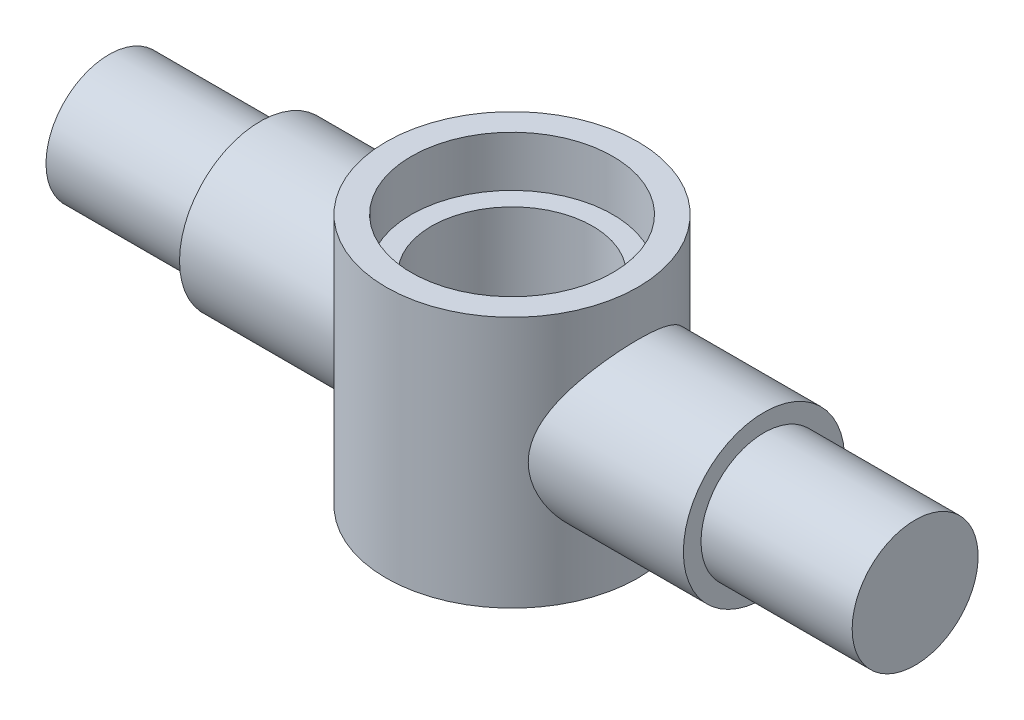
ISO-10303-21;
HEADER;
FILE_DESCRIPTION(('STEP AP214'),'2;1');
FILE_NAME('part.step','',(''),(''),'','','');
FILE_SCHEMA(('AUTOMOTIVE_DESIGN { 1 0 10303 214 1 1 1 1 }'));
ENDSEC;
DATA;
#1=APPLICATION_CONTEXT('core data for automotive mechanical design processes');
#2=APPLICATION_PROTOCOL_DEFINITION('international standard','automotive_design',2000,#1);
#3=PRODUCT_CONTEXT('',#1,'mechanical');
#4=PRODUCT('Part','Part','',(#3));
#5=PRODUCT_RELATED_PRODUCT_CATEGORY('part','',(#4));
#6=PRODUCT_DEFINITION_FORMATION('','',#4);
#7=PRODUCT_DEFINITION_CONTEXT('part definition',#1,'design');
#8=PRODUCT_DEFINITION('design','',#6,#7);
#9=PRODUCT_DEFINITION_SHAPE('','',#8);
#10=(LENGTH_UNIT() NAMED_UNIT(*) SI_UNIT(.MILLI.,.METRE.));
#11=(NAMED_UNIT(*) PLANE_ANGLE_UNIT() SI_UNIT($,.RADIAN.));
#12=(NAMED_UNIT(*) SI_UNIT($,.STERADIAN.) SOLID_ANGLE_UNIT());
#13=UNCERTAINTY_MEASURE_WITH_UNIT(LENGTH_MEASURE(1.E-05),#10,'distance_accuracy_value','');
#14=(GEOMETRIC_REPRESENTATION_CONTEXT(3) GLOBAL_UNCERTAINTY_ASSIGNED_CONTEXT((#13)) GLOBAL_UNIT_ASSIGNED_CONTEXT((#10,
#11,#12)) REPRESENTATION_CONTEXT('',''));
#15=CARTESIAN_POINT('',(0.,0.,0.));
#16=DIRECTION('',(0.,0.,1.));
#17=DIRECTION('',(1.,0.,0.));
#18=AXIS2_PLACEMENT_3D('',#15,#16,#17);
#19=CARTESIAN_POINT('',(0.,25.,0.));
#20=DIRECTION('',(0.,1.,0.));
#21=DIRECTION('',(-1.,0.,0.));
#22=AXIS2_PLACEMENT_3D('',#19,#20,#21);
#23=CYLINDRICAL_SURFACE('',#22,25.);
#24=CARTESIAN_POINT('',(0.,25.,0.));
#25=DIRECTION('',(0.,1.,0.));
#26=DIRECTION('',(-1.,0.,0.));
#27=AXIS2_PLACEMENT_3D('',#24,#25,#26);
#28=CIRCLE('',#27,25.);
#29=CARTESIAN_POINT('',(-25.,25.,0.));
#30=VERTEX_POINT('',#29);
#31=EDGE_CURVE('E66',#30,#30,#28,.T.);
#32=ORIENTED_EDGE('',*,*,#31,.F.);
#33=EDGE_LOOP('',(#32));
#34=FACE_BOUND('',#33,.T.);
#35=CARTESIAN_POINT('',(0.,-25.,0.));
#36=DIRECTION('',(0.,1.,0.));
#37=DIRECTION('',(-1.,0.,0.));
#38=AXIS2_PLACEMENT_3D('',#35,#36,#37);
#39=CIRCLE('',#38,25.);
#40=CARTESIAN_POINT('',(-25.,-25.,0.));
#41=VERTEX_POINT('',#40);
#42=EDGE_CURVE('E61',#41,#41,#39,.T.);
#43=ORIENTED_EDGE('',*,*,#42,.T.);
#44=EDGE_LOOP('',(#43));
#45=FACE_BOUND('',#44,.T.);
#46=CARTESIAN_POINT('',(19.2093727122986,0.,16.));
#47=CARTESIAN_POINT('',(19.2093602004703,-0.395450741818392,16.0000075518309));
#48=CARTESIAN_POINT('',(19.2216281701415,-0.790830022740218,15.985318558414));
#49=CARTESIAN_POINT('',(19.2700828129892,-1.57809681292205,15.9268763773465));
#50=CARTESIAN_POINT('',(19.3062771873145,-1.96998315674333,15.8831138318214));
#51=CARTESIAN_POINT('',(19.4010060093012,-2.74740735451356,15.7672610060305));
#52=CARTESIAN_POINT('',(19.4595765701312,-3.13293388953269,15.6951249278211));
#53=CARTESIAN_POINT('',(19.5965538328847,-3.89425061412518,15.5237584274562));
#54=CARTESIAN_POINT('',(19.6749599547327,-4.27004108806787,15.424528797624));
#55=CARTESIAN_POINT('',(19.8478677138077,-5.00648391302579,15.2013768268568));
#56=CARTESIAN_POINT('',(19.9422183799563,-5.36724195350467,15.0776843957441));
#57=CARTESIAN_POINT('',(20.144463471884,-6.07574987096303,14.80639059605));
#58=CARTESIAN_POINT('',(20.2523599296603,-6.42349778612012,14.6587856393959));
#59=CARTESIAN_POINT('',(20.4786703313642,-7.10487336943405,14.34092425358));
#60=CARTESIAN_POINT('',(20.5970838421642,-7.43850161825142,14.1706687570999));
#61=CARTESIAN_POINT('',(20.8415708471704,-8.09089316911373,13.8085717175924));
#62=CARTESIAN_POINT('',(20.9676448352994,-8.40965551030582,13.6167287819958));
#63=CARTESIAN_POINT('',(21.2429784742916,-9.07571937888856,13.183726884198));
#64=CARTESIAN_POINT('',(21.3929937414824,-9.42067256852973,12.9394311786344));
#65=CARTESIAN_POINT('',(21.6958102059326,-10.089453664192,12.4250119334488));
#66=CARTESIAN_POINT('',(21.8486115820407,-10.4132802078776,12.1548867309956));
#67=CARTESIAN_POINT('',(22.153690243193,-11.0390522050631,11.5895322792664));
#68=CARTESIAN_POINT('',(22.3059669935383,-11.3409794346957,11.2942825562918));
#69=CARTESIAN_POINT('',(22.6066292638259,-11.9214646022861,10.6797634395583));
#70=CARTESIAN_POINT('',(22.7550145449759,-12.2000211084417,10.3604925764188));
#71=CARTESIAN_POINT('',(23.0635047016872,-12.7667075937182,9.65613685196289));
#72=CARTESIAN_POINT('',(23.2226498605155,-13.0514317810644,9.26787638476107));
#73=CARTESIAN_POINT('',(23.5277165227615,-13.5868256125372,8.46354327157017));
#74=CARTESIAN_POINT('',(23.6736365980179,-13.8374915802119,8.04746763026314));
#75=CARTESIAN_POINT('',(23.9479803876146,-14.3017764357153,7.19003859126286));
#76=CARTESIAN_POINT('',(24.0764176374088,-14.5154240190881,6.74870512893474));
#77=CARTESIAN_POINT('',(24.3119879120981,-14.9029000599008,5.84344355319203));
#78=CARTESIAN_POINT('',(24.4191250484791,-15.076736202989,5.37951982186268));
#79=CARTESIAN_POINT('',(24.5985926447151,-15.3656160862095,4.48282903672906));
#80=CARTESIAN_POINT('',(24.6734013192139,-15.4849249997567,4.05193075208175));
#81=CARTESIAN_POINT('',(24.801040881362,-15.6875056250082,3.17853043332122));
#82=CARTESIAN_POINT('',(24.8538731689283,-15.7707796321842,2.73602914024029));
#83=CARTESIAN_POINT('',(24.9359332327917,-15.8997874849552,1.84383752201984));
#84=CARTESIAN_POINT('',(24.9651830643106,-15.9455564074084,1.39415431610935));
#85=CARTESIAN_POINT('',(24.9992426632787,-15.9988302400714,0.491624497686979));
#86=CARTESIAN_POINT('',(25.0040554585505,-16.0063398907209,0.0387782840441665));
#87=CARTESIAN_POINT('',(24.9901621157745,-15.9846245464524,-0.80180702025826));
#88=CARTESIAN_POINT('',(24.9746698897481,-15.9604195679006,-1.18974170793274));
#89=CARTESIAN_POINT('',(24.925916743737,-15.8840233753194,-1.96167918510344));
#90=CARTESIAN_POINT('',(24.8926579243074,-15.8318354697257,-2.34568243394718));
#91=CARTESIAN_POINT('',(24.809124943467,-15.7001676417372,-3.10709482157081));
#92=CARTESIAN_POINT('',(24.7588500773314,-15.6206865889864,-3.48450368656139));
#93=CARTESIAN_POINT('',(24.6423835379047,-15.4354220324528,-4.23029490411503));
#94=CARTESIAN_POINT('',(24.5761911870475,-15.3296374089885,-4.59867687169073));
#95=CARTESIAN_POINT('',(24.429246979534,-15.0929359518799,-5.3243786114757));
#96=CARTESIAN_POINT('',(24.3484911868781,-14.9620123234025,-5.68169536247057));
#97=CARTESIAN_POINT('',(24.1740178828328,-14.6763730310704,-6.38338290414122));
#98=CARTESIAN_POINT('',(24.0803005538868,-14.5216577020983,-6.72775387695178));
#99=CARTESIAN_POINT('',(23.88162522246,-14.1897742394938,-7.40213203498125));
#100=CARTESIAN_POINT('',(23.7766665635656,-14.0126047945902,-7.73213837982413));
#101=CARTESIAN_POINT('',(23.5573305378522,-13.6371200068658,-8.37663930224959));
#102=CARTESIAN_POINT('',(23.4429521112619,-13.4388022840152,-8.69113212810155));
#103=CARTESIAN_POINT('',(23.1916461498523,-12.9957628822917,-9.34261350029824));
#104=CARTESIAN_POINT('',(23.0537005367941,-12.7483470877916,-9.67737906939421));
#105=CARTESIAN_POINT('',(22.7710425195163,-12.2297848715424,-10.3249438913943));
#106=CARTESIAN_POINT('',(22.6263296265049,-11.9586367344007,-10.6377415534904));
#107=CARTESIAN_POINT('',(22.3328215884758,-11.3935639779315,-11.2408946521999));
#108=CARTESIAN_POINT('',(22.1840210043112,-11.0996079572823,-11.5312180082151));
#109=CARTESIAN_POINT('',(21.8855595984986,-10.4903882100913,-12.0880975088665));
#110=CARTESIAN_POINT('',(21.7358987343383,-10.1751234221084,-12.3546524680053));
#111=CARTESIAN_POINT('',(21.4181651432605,-9.47875337366146,-12.8986334479259));
#112=CARTESIAN_POINT('',(21.2504398360994,-9.09460175903957,-13.1723794101635));
#113=CARTESIAN_POINT('',(20.9231280377543,-8.30108239529781,-13.6863281692123));
#114=CARTESIAN_POINT('',(20.7635431930463,-7.89170958165703,-13.9265241972136));
#115=CARTESIAN_POINT('',(20.4583462502362,-7.04964812228662,-14.3711052241852));
#116=CARTESIAN_POINT('',(20.3127140688785,-6.61699443242505,-14.5755420556062));
#117=CARTESIAN_POINT('',(20.1091927064436,-5.95182141302221,-14.8537397354869));
#118=CARTESIAN_POINT('',(20.043847548657,-5.72742835996075,-14.9417198388729));
#119=CARTESIAN_POINT('',(19.9188677051513,-5.27341753747447,-15.107928903543));
#120=CARTESIAN_POINT('',(19.8592344402921,-5.0437984855479,-15.1861554400349));
#121=CARTESIAN_POINT('',(19.720753651965,-4.47386707312211,-15.3658713186935));
#122=CARTESIAN_POINT('',(19.645552574875,-4.13084777878346,-15.4616911152538));
#123=CARTESIAN_POINT('',(19.5113255727846,-3.43625908207935,-15.6307339070693));
#124=CARTESIAN_POINT('',(19.4522955441895,-3.08469187354872,-15.7039626356712));
#125=CARTESIAN_POINT('',(19.3524938058948,-2.37531516224826,-15.8267893922012));
#126=CARTESIAN_POINT('',(19.3116995928932,-2.01751392232937,-15.8764165497243));
#127=CARTESIAN_POINT('',(19.24981462822,-1.29766012634529,-15.9513955181358));
#128=CARTESIAN_POINT('',(19.2287241117882,-0.935607519575858,-15.9767470392006));
#129=CARTESIAN_POINT('',(19.2070655710883,-0.208914040156356,-16.0027787782538));
#130=CARTESIAN_POINT('',(19.2065587736387,0.155731327892917,-16.0033853918814));
#131=CARTESIAN_POINT('',(19.2262437044411,0.883646492477322,-15.9797303685735));
#132=CARTESIAN_POINT('',(19.2464355421881,1.24691628172549,-15.9554686000853));
#133=CARTESIAN_POINT('',(19.3067193481981,1.96956504405772,-15.8824686441804));
#134=CARTESIAN_POINT('',(19.3468257479805,2.32894100212412,-15.8337127062304));
#135=CARTESIAN_POINT('',(19.4454047345737,3.04108188334854,-15.7124891921192));
#136=CARTESIAN_POINT('',(19.5038777302889,3.39384665913328,-15.640021088041));
#137=CARTESIAN_POINT('',(19.6353070822549,4.08117003267904,-15.4746735603332));
#138=CARTESIAN_POINT('',(19.7078206333577,4.41596250211351,-15.3824106552207));
#139=CARTESIAN_POINT('',(19.8661366285732,5.07603904878438,-15.1773980264134));
#140=CARTESIAN_POINT('',(19.9519442856407,5.4013193363182,-15.0646402631501));
#141=CARTESIAN_POINT('',(20.2259366590945,6.36115702066662,-14.6970969552363));
#142=CARTESIAN_POINT('',(20.4307664709313,6.98008445692647,-14.4129501324544));
#143=CARTESIAN_POINT('',(20.7791231934689,7.92978311110474,-13.9025759153207));
#144=CARTESIAN_POINT('',(20.9141789774944,8.27634446914637,-13.6990065677717));
#145=CARTESIAN_POINT('',(21.1904755475319,8.95159599548267,-13.2676036626528));
#146=CARTESIAN_POINT('',(21.331716916245,9.28028447353068,-13.0397678161961));
#147=CARTESIAN_POINT('',(21.617328622136,9.91920804166725,-12.5606127955534));
#148=CARTESIAN_POINT('',(21.7617021658761,10.2294228728555,-12.3092685900815));
#149=CARTESIAN_POINT('',(22.0504950386983,10.83022156592,-11.7841200489597));
#150=CARTESIAN_POINT('',(22.1949143700021,11.1208042527167,-11.5103143710492));
#151=CARTESIAN_POINT('',(22.5068806894766,11.7320378290204,-10.8895251971102));
#152=CARTESIAN_POINT('',(22.6738912555057,12.0486339518646,-10.538258852383));
#153=CARTESIAN_POINT('',(22.9997454081353,12.6511856036189,-9.80673841828236));
#154=CARTESIAN_POINT('',(23.1585876314467,12.9371360263668,-9.42647951620012));
#155=CARTESIAN_POINT('',(23.4637861759484,13.4758482705846,-8.63879825507577));
#156=CARTESIAN_POINT('',(23.6101533508035,13.7286390473383,-8.23140006944534));
#157=CARTESIAN_POINT('',(23.8173475602848,14.0810166740321,-7.6015049033319));
#158=CARTESIAN_POINT('',(23.8843490627493,14.1940015577088,-7.38842079738173));
#159=CARTESIAN_POINT('',(24.0137961299491,14.4107587612229,-6.95618401063909));
#160=CARTESIAN_POINT('',(24.0762405186914,14.5145287045722,-6.73702978339917));
#161=CARTESIAN_POINT('',(24.2320055848663,14.7717973408357,-6.15995796925272));
#162=CARTESIAN_POINT('',(24.321400053688,14.9178236369807,-5.79759896313244));
#163=CARTESIAN_POINT('',(24.4854315282584,15.1837844441139,-5.06026412930273));
#164=CARTESIAN_POINT('',(24.5600711973214,15.3037236643405,-4.6852905929035));
#165=CARTESIAN_POINT('',(24.6929742121903,15.5161154342713,-3.92502403877744));
#166=CARTESIAN_POINT('',(24.7512476771231,15.6085849703693,-3.53973755962496));
#167=CARTESIAN_POINT('',(24.8501510392655,15.7649509257018,-2.76115486747052));
#168=CARTESIAN_POINT('',(24.8907806004012,15.8288468006774,-2.36785850204886));
#169=CARTESIAN_POINT('',(24.9535312925749,15.9273404409633,-1.57480221577731));
#170=CARTESIAN_POINT('',(24.9755905708137,15.9618403003625,-1.17502517982108));
#171=CARTESIAN_POINT('',(25.0004272981601,16.0006746513738,-0.373405625880856));
#172=CARTESIAN_POINT('',(25.0032047459269,16.0050091408883,0.0284368922467549));
#173=CARTESIAN_POINT('',(24.9894083698085,15.9834476229949,0.831001220465041));
#174=CARTESIAN_POINT('',(24.9728331376842,15.9575494156401,1.23172294687187));
#175=CARTESIAN_POINT('',(24.9207400616191,15.8759022758455,2.02885267808105));
#176=CARTESIAN_POINT('',(24.8852226810495,15.8201540736094,2.42526078816295));
#177=CARTESIAN_POINT('',(24.7984189745796,15.68324665588,3.19044626417198));
#178=CARTESIAN_POINT('',(24.7480444224836,15.6035527406556,3.55959149260969));
#179=CARTESIAN_POINT('',(24.6320994030311,15.4189971904595,4.28906417390255));
#180=CARTESIAN_POINT('',(24.5665295814812,15.3141366250765,4.64939200078243));
#181=CARTESIAN_POINT('',(24.4214925565386,15.0803746063925,5.35928858254075));
#182=CARTESIAN_POINT('',(24.3420245415617,14.9514717491141,5.70885670770437));
#183=CARTESIAN_POINT('',(24.170683642612,14.6708653525123,6.39556994704414));
#184=CARTESIAN_POINT('',(24.0788100748657,14.5191605563319,6.73271437514203));
#185=CARTESIAN_POINT('',(23.8769190367743,14.1819204834617,7.41821218958759));
#186=CARTESIAN_POINT('',(23.7660547293117,13.9946940329281,7.76548374262893));
#187=CARTESIAN_POINT('',(23.533987358231,13.5968623110591,8.44272462594597));
#188=CARTESIAN_POINT('',(23.4127838763452,13.3862560937994,8.77269325536516));
#189=CARTESIAN_POINT('',(23.1621773907135,12.942948547228,9.41447208281313));
#190=CARTESIAN_POINT('',(23.0327692434887,12.7102333113594,9.72627065030755));
#191=CARTESIAN_POINT('',(22.7681033449974,12.224078988506,10.3306501038477));
#192=CARTESIAN_POINT('',(22.6328450147247,11.9706378480088,10.6232290804345));
#193=CARTESIAN_POINT('',(22.3378986081481,11.4038990021542,11.2316218874087));
#194=CARTESIAN_POINT('',(22.1776354019021,11.0873722519175,11.5441559130474));
#195=CARTESIAN_POINT('',(21.8562350326654,10.4296383547698,12.1416680025961));
#196=CARTESIAN_POINT('',(21.6950977427163,10.0884275286712,12.4266419437925));
#197=CARTESIAN_POINT('',(21.375928274595,9.38240404588214,12.9679779160604));
#198=CARTESIAN_POINT('',(21.2178973024897,9.01758244911158,13.2243290079454));
#199=CARTESIAN_POINT('',(20.9093760040417,8.26556414666313,13.7069324509098));
#200=CARTESIAN_POINT('',(20.7588843294594,7.87837146842734,13.933190195594));
#201=CARTESIAN_POINT('',(20.4904053646846,7.13850609897017,14.3245055255624));
#202=CARTESIAN_POINT('',(20.3708181994352,6.78859802866815,14.4936962326903));
#203=CARTESIAN_POINT('',(20.1439415106924,6.07397381223701,14.8074000887338));
#204=CARTESIAN_POINT('',(20.0366521382654,5.70925748427749,14.9519129345167));
#205=CARTESIAN_POINT('',(19.837970972326,4.96714496507768,15.2145325262258));
#206=CARTESIAN_POINT('',(19.7465442856356,4.58977884054347,15.3326973975323));
#207=CARTESIAN_POINT('',(19.5826454523432,3.82361318584246,15.5414800751121));
#208=CARTESIAN_POINT('',(19.5101663424499,3.43481791452258,15.6321080032873));
#209=CARTESIAN_POINT('',(19.3709744142914,2.54459093114955,15.8044576067829));
#210=CARTESIAN_POINT('',(19.3107841815136,2.04041323215055,15.8775776488039));
#211=CARTESIAN_POINT('',(19.2299909394771,1.02411722304983,15.9753445575078));
#212=CARTESIAN_POINT('',(19.209388911636,0.51199871640755,15.9999902224795));
#213=CARTESIAN_POINT('',(19.2093727122986,0.,16.));
#214=B_SPLINE_CURVE_WITH_KNOTS('',3,(#46,#47,#48,#49,#50,#51,#52,#53,#54,#55,#56,#57,#58,#59,
#60,#61,#62,#63,#64,#65,#66,#67,#68,#69,#70,#71,#72,#73,#74,#75,#76,#77,#78,#79,#80,#81,#82,#83,
#84,#85,#86,#87,#88,#89,#90,#91,#92,#93,#94,#95,#96,#97,#98,#99,#100,#101,#102,#103,#104,#105,
#106,#107,#108,#109,#110,#111,#112,#113,#114,#115,#116,#117,#118,#119,#120,#121,#122,#123,#124,
#125,#126,#127,#128,#129,#130,#131,#132,#133,#134,#135,#136,#137,#138,#139,#140,#141,#142,#143,
#144,#145,#146,#147,#148,#149,#150,#151,#152,#153,#154,#155,#156,#157,#158,#159,#160,#161,#162,
#163,#164,#165,#166,#167,#168,#169,#170,#171,#172,#173,#174,#175,#176,#177,#178,#179,#180,#181,
#182,#183,#184,#185,#186,#187,#188,#189,#190,#191,#192,#193,#194,#195,#196,#197,#198,#199,#200,
#201,#202,#203,#204,#205,#206,#207,#208,#209,#210,#211,#212,#213),.UNSPECIFIED.,.T.,.F.,(4,2,2,
2,2,2,2,2,2,2,2,2,2,2,2,2,2,2,2,2,2,2,2,2,2,2,2,2,2,2,2,2,2,2,2,2,2,2,2,2,2,2,2,2,2,2,2,2,2,2,2,
2,2,2,2,2,2,2,2,2,2,2,2,2,2,2,2,2,2,2,2,2,2,2,2,2,2,2,2,2,2,2,2,4),(0.,1.18577451563378,
2.3719308803307,3.56000973844409,4.74805385612807,5.92542182765323,7.10296662705879,
8.28046295368245,9.45803528219828,10.8023160446125,12.1466834064257,13.4921569662333,
14.8377128960858,16.3569602143826,17.876371399424,19.3945994612358,20.9125341796885,
22.2705040937009,23.6283874904697,24.9849994644068,26.3414433459186,27.5070310105171,
28.6724808974644,29.8379790577811,31.0035268391193,32.1693901015006,33.3352369551525,
34.5011519231031,35.6671982420161,36.981484304163,38.2958654425361,39.6120894425729,
40.9283790552946,42.4284846788318,43.9288925178197,45.4271071822749,46.1760210388417,
46.9251207099888,48.0159853843354,49.1065729819124,50.1958110356673,51.2850620935235,
52.3775529210133,53.4700495277667,54.5633389938717,55.6566528021364,56.7198824116749,
57.783530000594,59.909660789382,61.1808078676574,62.4520749505808,63.7247114101544,
64.9974239758645,66.5001130296407,68.0030520722831,69.5046698733184,70.2553847672213,
71.0062927079441,72.2072677819863,73.408025875761,74.6080399052386,75.8080767910933,
77.0120950499146,78.2161133924544,79.4202193534208,80.6242958603644,81.766023444616,
82.9077025137561,84.0494482734539,85.1912569899845,86.4194532766275,87.647699273107,
88.8767230159272,90.105868677688,91.5228092826638,92.9399615210126,94.357653531239,
95.7750911063543,96.9939255712751,98.2127750067778,99.4289083750166,100.644594180297,
102.179804297619,103.715052473312),.UNSPECIFIED.);
#215=CARTESIAN_POINT('',(19.2093727122986,0.,16.));
#216=VERTEX_POINT('',#215);
#217=EDGE_CURVE('E56',#216,#216,#214,.T.);
#218=ORIENTED_EDGE('',*,*,#217,.F.);
#219=EDGE_LOOP('',(#218));
#220=FACE_BOUND('',#219,.T.);
#221=CARTESIAN_POINT('',(-25.,-16.,0.));
#222=CARTESIAN_POINT('',(-25.0000015619882,-16.0000018773157,0.404925044071176));
#223=CARTESIAN_POINT('',(-24.990142097665,-15.9846099706385,0.809832411815946));
#224=CARTESIAN_POINT('',(-24.9509510419688,-15.92326968288,1.61652618236302));
#225=CARTESIAN_POINT('',(-24.9216122625561,-15.8773100220158,2.01831137766447));
#226=CARTESIAN_POINT('',(-24.8441286420605,-15.7554098701401,2.81604821037115));
#227=CARTESIAN_POINT('',(-24.7959565811092,-15.6794259832054,3.21199053959221));
#228=CARTESIAN_POINT('',(-24.6819740036757,-15.4985408355827,3.99456099671031));
#229=CARTESIAN_POINT('',(-24.6161648797958,-15.3936418579784,4.38118985736236));
#230=CARTESIAN_POINT('',(-24.468785547579,-15.1568468243231,5.1407660907412));
#231=CARTESIAN_POINT('',(-24.3872961899422,-15.025089059471,5.51377244407855));
#232=CARTESIAN_POINT('',(-24.2100855842812,-14.7357159583602,6.24609510158277));
#233=CARTESIAN_POINT('',(-24.114364104839,-14.5781002016396,6.60541118302289));
#234=CARTESIAN_POINT('',(-23.9106324755014,-14.2385667901493,7.30859986653982));
#235=CARTESIAN_POINT('',(-23.8026253610819,-14.0566551363675,7.65247625422318));
#236=CARTESIAN_POINT('',(-23.5763254629354,-13.6699562899151,8.32360019852908));
#237=CARTESIAN_POINT('',(-23.4580313681202,-13.4651661804078,8.65084562706961));
#238=CARTESIAN_POINT('',(-23.2032751229575,-13.0164828623738,9.31365412183656));
#239=CARTESIAN_POINT('',(-23.0661182340287,-12.7707619235136,9.64771274316308));
#240=CARTESIAN_POINT('',(-22.7850064089793,-12.2557366535805,10.2940617258667));
#241=CARTESIAN_POINT('',(-22.6410511668713,-11.9864312605261,10.6063511058609));
#242=CARTESIAN_POINT('',(-22.3490022897849,-11.4252092234652,11.2086687230747));
#243=CARTESIAN_POINT('',(-22.2009034973146,-11.1332635184821,11.4986673651025));
#244=CARTESIAN_POINT('',(-21.9037344054836,-10.5282019106555,12.0551203444099));
#245=CARTESIAN_POINT('',(-21.7546640715094,-10.2150852497817,12.3215738378621));
#246=CARTESIAN_POINT('',(-21.4374499122155,-9.52219977657806,12.8665793254927));
#247=CARTESIAN_POINT('',(-21.2696389657507,-9.13931438351679,13.1413799496497));
#248=CARTESIAN_POINT('',(-20.9419379170098,-8.34831618545199,13.6575524379486));
#249=CARTESIAN_POINT('',(-20.7820494133894,-7.94019832587866,13.8989175727052));
#250=CARTESIAN_POINT('',(-20.4759821659353,-7.10058524689527,14.3459904698911));
#251=CARTESIAN_POINT('',(-20.3297848843603,-6.66912292284908,14.5517467761611));
#252=CARTESIAN_POINT('',(-20.1252100289451,-6.00569055390515,14.8320367864773));
#253=CARTESIAN_POINT('',(-20.0594794225191,-5.78186975362472,14.9207331379766));
#254=CARTESIAN_POINT('',(-19.9336577942813,-5.3289818989008,15.0884150598226));
#255=CARTESIAN_POINT('',(-19.8735682005867,-5.09991353411016,15.16739817266));
#256=CARTESIAN_POINT('',(-19.7336948385013,-4.53055229253544,15.3492623867947));
#257=CARTESIAN_POINT('',(-19.6575477076493,-4.18751389202039,15.4464497728831));
#258=CARTESIAN_POINT('',(-19.521358473509,-3.49276536899716,15.6182136002394));
#259=CARTESIAN_POINT('',(-19.4613122707708,-3.14105747877333,15.6927957976356));
#260=CARTESIAN_POINT('',(-19.3594402998739,-2.43126972701604,15.8183001813279));
#261=CARTESIAN_POINT('',(-19.3175916839816,-2.07319844663942,15.8692520417559));
#262=CARTESIAN_POINT('',(-19.2535956523238,-1.35265801288985,15.9468367737907));
#263=CARTESIAN_POINT('',(-19.231448454688,-0.990188810869143,15.9734693761403));
#264=CARTESIAN_POINT('',(-19.2077129340946,-0.26246015615067,16.0020035959886));
#265=CARTESIAN_POINT('',(-19.2061890356968,0.10280447537217,16.0038277150333));
#266=CARTESIAN_POINT('',(-19.2239297577434,0.832091460399482,15.9825126443981));
#267=CARTESIAN_POINT('',(-19.24319448145,1.1961138077242,15.9593733307184));
#268=CARTESIAN_POINT('',(-19.3017467127909,1.92037328223285,15.8885074198919));
#269=CARTESIAN_POINT('',(-19.3410485617405,2.28060750937628,15.8407632118421));
#270=CARTESIAN_POINT('',(-19.4381624474468,2.99454239108447,15.7214419318028));
#271=CARTESIAN_POINT('',(-19.4959748739967,3.34824290789737,15.6498643579324));
#272=CARTESIAN_POINT('',(-19.6260739031015,4.03652558609996,15.4863735674023));
#273=CARTESIAN_POINT('',(-19.6978709558272,4.37136256989056,15.3951393603923));
#274=CARTESIAN_POINT('',(-19.8548252831694,5.03160397521627,15.1921818732878));
#275=CARTESIAN_POINT('',(-19.9399877947337,5.35700463988336,15.0804505589621));
#276=CARTESIAN_POINT('',(-20.2121658403417,6.31729900859783,14.7159808896165));
#277=CARTESIAN_POINT('',(-20.415946958597,6.93665942019118,14.4338764142666));
#278=CARTESIAN_POINT('',(-20.7627220180091,7.88670986628182,13.9270311591719));
#279=CARTESIAN_POINT('',(-20.8971209302017,8.23315173665737,13.7249831568112));
#280=CARTESIAN_POINT('',(-21.1722128751606,8.90828480780035,13.296696161189));
#281=CARTESIAN_POINT('',(-21.3129064950318,9.23697434647772,13.0704549086854));
#282=CARTESIAN_POINT('',(-21.5975435918726,9.87602455074263,12.5945655171766));
#283=CARTESIAN_POINT('',(-21.741490387645,10.1863652117508,12.3448925721126));
#284=CARTESIAN_POINT('',(-22.0295648350163,10.7875537186817,11.823159163581));
#285=CARTESIAN_POINT('',(-22.1736924970078,11.0784003868203,11.5510973496357));
#286=CARTESIAN_POINT('',(-22.4854503237815,11.6908990129197,10.9336594778248));
#287=CARTESIAN_POINT('',(-22.6525676241315,12.0084814733917,10.5839664649273));
#288=CARTESIAN_POINT('',(-22.9788334546104,12.6131505683738,9.85558430354048));
#289=CARTESIAN_POINT('',(-23.1379806516688,12.9002321102804,9.47689033099586));
#290=CARTESIAN_POINT('',(-23.4439951491246,13.4413788795508,8.69230147452352));
#291=CARTESIAN_POINT('',(-23.5908728474814,13.695472166599,8.28643015897213));
#292=CARTESIAN_POINT('',(-23.7989867549893,14.0499422909588,7.65877791158846));
#293=CARTESIAN_POINT('',(-23.8663204968941,14.1636478233454,7.44643333273029));
#294=CARTESIAN_POINT('',(-23.9964832307619,14.3818943973732,7.01565570471914));
#295=CARTESIAN_POINT('',(-24.0593110591769,14.4864330734262,6.79722110303669));
#296=CARTESIAN_POINT('',(-24.2163596379815,14.7461292462035,6.22117702909599));
#297=CARTESIAN_POINT('',(-24.3066645830134,14.8937970331853,5.85907262264253));
#298=CARTESIAN_POINT('',(-24.472571043401,15.1630462524395,5.12210088957014));
#299=CARTESIAN_POINT('',(-24.5481752064179,15.2846323825156,4.74723587549781));
#300=CARTESIAN_POINT('',(-24.6830408717459,15.5003093339703,3.98702789616476));
#301=CARTESIAN_POINT('',(-24.7423124565402,15.5944171205238,3.60169155725472));
#302=CARTESIAN_POINT('',(-24.8432233011495,15.7540335011103,2.82284294906273));
#303=CARTESIAN_POINT('',(-24.8848622338729,15.8195415646094,2.42933052825374));
#304=CARTESIAN_POINT('',(-24.9496239299749,15.9212210484698,1.63564062619808));
#305=CARTESIAN_POINT('',(-24.9726833167174,15.9572920615261,1.23544504541875));
#306=CARTESIAN_POINT('',(-24.999477761314,15.9991921444795,0.432822676299686));
#307=CARTESIAN_POINT('',(-25.003212815007,16.0050212078647,0.03039588747952));
#308=CARTESIAN_POINT('',(-24.9912650807508,15.9863498172394,-0.773483996299102));
#309=CARTESIAN_POINT('',(-24.9755811323802,15.9618475507195,-1.17493703163255));
#310=CARTESIAN_POINT('',(-24.9251836971058,15.8828746268655,-1.97366097901496));
#311=CARTESIAN_POINT('',(-24.8904707030591,15.8284047456999,-2.37093199910754));
#312=CARTESIAN_POINT('',(-24.8052000041332,15.6939634497678,-3.1373120950908));
#313=CARTESIAN_POINT('',(-24.7555850388601,15.6155053701039,-3.50679388900718));
#314=CARTESIAN_POINT('',(-24.6411050211604,15.4333752681049,-4.23704308721495));
#315=CARTESIAN_POINT('',(-24.5762406334449,15.3297043447724,-4.59781087058803));
#316=CARTESIAN_POINT('',(-24.4325489543541,15.098267274378,-5.30867908099266));
#317=CARTESIAN_POINT('',(-24.3537207449646,14.9704995431003,-5.65877880490657));
#318=CARTESIAN_POINT('',(-24.1835862363121,14.6921060234087,-6.3466296016523));
#319=CARTESIAN_POINT('',(-24.092279251275,14.5414789787058,-6.68437999452993));
#320=CARTESIAN_POINT('',(-23.8916275742825,14.2066584791477,-7.37070229752057));
#321=CARTESIAN_POINT('',(-23.7814473707268,14.0208041517277,-7.71821923165123));
#322=CARTESIAN_POINT('',(-23.5506783083945,13.6257168103069,-8.39605638651569));
#323=CARTESIAN_POINT('',(-23.430089041497,13.4164828795388,-8.72637593215575));
#324=CARTESIAN_POINT('',(-23.180630204464,12.9759241468037,-9.36895085200483));
#325=CARTESIAN_POINT('',(-23.0517555610962,12.7445857670566,-9.68119493171719));
#326=CARTESIAN_POINT('',(-22.7880601838735,12.2611877169459,-10.2865613887257));
#327=CARTESIAN_POINT('',(-22.6532388486398,12.0091259486241,-10.579681824615));
#328=CARTESIAN_POINT('',(-22.3591293702995,11.4453931745428,-11.1893099340712));
#329=CARTESIAN_POINT('',(-22.1992483653671,11.1304967694322,-11.5025558397825));
#330=CARTESIAN_POINT('',(-21.8784405932856,10.4760453865055,-12.1016246389836));
#331=CARTESIAN_POINT('',(-21.7175136803215,10.1364869002433,-12.3874436172205));
#332=CARTESIAN_POINT('',(-21.3985808420018,9.43383774878562,-12.9305814468634));
#333=CARTESIAN_POINT('',(-21.2405756556402,9.07074123197174,-13.1878931678842));
#334=CARTESIAN_POINT('',(-20.9318561584343,8.32218851305903,-13.6725981697187));
#335=CARTESIAN_POINT('',(-20.7811407458473,7.93673570927365,-13.8999959805734));
#336=CARTESIAN_POINT('',(-20.5114248571981,7.19860411557443,-14.2944225726149));
#337=CARTESIAN_POINT('',(-20.3909016210024,6.84861937048303,-14.4654551193313));
#338=CARTESIAN_POINT('',(-20.1620574047653,6.13377200246868,-14.7827501975162));
#339=CARTESIAN_POINT('',(-20.0537340572626,5.76891228490502,-14.9290175376039));
#340=CARTESIAN_POINT('',(-19.8527690015487,5.02594698508986,-15.1952420148147));
#341=CARTESIAN_POINT('',(-19.7601104179272,4.64785619353895,-15.315227506719));
#342=CARTESIAN_POINT('',(-19.5936975313565,3.87987504664824,-15.5275641940392));
#343=CARTESIAN_POINT('',(-19.5199429946438,3.4899848372842,-15.6199157311731));
#344=CARTESIAN_POINT('',(-19.3938056687495,2.69708614747011,-15.7762650376));
#345=CARTESIAN_POINT('',(-19.3416363723446,2.29398728836183,-15.8399800811272));
#346=CARTESIAN_POINT('',(-19.2621898317534,1.48164477784622,-15.9364986807434));
#347=CARTESIAN_POINT('',(-19.2349119436678,1.0724012856687,-15.9693030364411));
#348=CARTESIAN_POINT('',(-19.2066524645509,0.251937882014704,-16.0032809353728));
#349=CARTESIAN_POINT('',(-19.2056547442586,-0.159280662259524,-16.004473879882));
#350=CARTESIAN_POINT('',(-19.2299728056356,-0.979782619212483,-15.9752468012828));
#351=CARTESIAN_POINT('',(-19.2552864904598,-1.38906618348532,-15.9448292973182));
#352=CARTESIAN_POINT('',(-19.3254345723058,-2.1429859770789,-15.8596997261338));
#353=CARTESIAN_POINT('',(-19.3669198547315,-2.48841817165343,-15.8091331210736));
#354=CARTESIAN_POINT('',(-19.4667172401765,-3.17297476292449,-15.6860828655746));
#355=CARTESIAN_POINT('',(-19.5250341268026,-3.51209733719602,-15.6135929841754));
#356=CARTESIAN_POINT('',(-19.6566579347328,-4.18238074207573,-15.4475564981701));
#357=CARTESIAN_POINT('',(-19.7299743789902,-4.51353636459322,-15.3539965127064));
#358=CARTESIAN_POINT('',(-19.8894647238651,-5.1663373347986,-15.1468238889593));
#359=CARTESIAN_POINT('',(-19.9756403612109,-5.48798139083824,-15.0332085416725));
#360=CARTESIAN_POINT('',(-20.1902486625657,-6.2299347962595,-14.7443693949179));
#361=CARTESIAN_POINT('',(-20.3230031980176,-6.64600179716924,-14.5614134998204));
#362=CARTESIAN_POINT('',(-20.6025569184015,-7.45724147650319,-14.1631148541737));
#363=CARTESIAN_POINT('',(-20.7493557588791,-7.85241466700576,-13.9477728978596));
#364=CARTESIAN_POINT('',(-21.0523136209136,-8.62118734138439,-13.4861556789325));
#365=CARTESIAN_POINT('',(-21.2084841630588,-8.99475911587268,-13.239841918056));
#366=CARTESIAN_POINT('',(-21.5254932104697,-9.71868049711563,-12.7179541719606));
#367=CARTESIAN_POINT('',(-21.6863313712946,-10.0690318111599,-12.442382341833));
#368=CARTESIAN_POINT('',(-22.010442238798,-10.7494224070127,-11.8597161505609));
#369=CARTESIAN_POINT('',(-22.1737212606611,-11.0791728601149,-11.5522878757903));
#370=CARTESIAN_POINT('',(-22.4968024507648,-11.7123977011906,-10.9097759508097));
#371=CARTESIAN_POINT('',(-22.6566045458943,-12.0158715370322,-10.5746917197737));
#372=CARTESIAN_POINT('',(-22.9689581645052,-12.5949385398338,-9.87788824812155));
#373=CARTESIAN_POINT('',(-23.1215088222784,-12.8705283822917,-9.51616584039962));
#374=CARTESIAN_POINT('',(-23.3420621846538,-13.2613498914431,-8.95480859407567));
#375=CARTESIAN_POINT('',(-23.4142021245946,-13.3878647497722,-8.76455786261007));
#376=CARTESIAN_POINT('',(-23.5553237080331,-13.6331707030461,-8.37789362684303));
#377=CARTESIAN_POINT('',(-23.6243041595969,-13.7519588900481,-8.18147784307569));
#378=CARTESIAN_POINT('',(-23.8300744697518,-14.1035237172432,-7.57072389698189));
#379=CARTESIAN_POINT('',(-23.9609814020929,-14.323210508379,-7.14672497942355));
#380=CARTESIAN_POINT('',(-24.2035792788676,-14.7254539287129,-6.27620668494683));
#381=CARTESIAN_POINT('',(-24.3152735453922,-14.9080169780295,-5.82969121870037));
#382=CARTESIAN_POINT('',(-24.4657106327018,-15.1517335983943,-5.14619804504744));
#383=CARTESIAN_POINT('',(-24.5129636821995,-15.2278849584961,-4.91633650685712));
#384=CARTESIAN_POINT('',(-24.6014604241758,-15.3699361290149,-4.45240645515483));
#385=CARTESIAN_POINT('',(-24.6427057539856,-15.4358387329389,-4.21833910749463));
#386=CARTESIAN_POINT('',(-24.756860888756,-15.6176557338748,-3.51078593222692));
#387=CARTESIAN_POINT('',(-24.8202802251292,-15.7178247777842,-3.03154239159495));
#388=CARTESIAN_POINT('',(-24.912855714342,-15.8635762871447,-2.12784973800437));
#389=CARTESIAN_POINT('',(-24.9454536896083,-15.9146575501143,-1.70461817648607));
#390=CARTESIAN_POINT('',(-24.989025253133,-15.982868800304,-0.854251246410916));
#391=CARTESIAN_POINT('',(-24.9999983524116,-15.9999980198034,-0.427115789798919));
#392=CARTESIAN_POINT('',(-25.,-16.,0.));
#393=B_SPLINE_CURVE_WITH_KNOTS('',3,(#221,#222,#223,#224,#225,#226,#227,#228,#229,#230,#231,
#232,#233,#234,#235,#236,#237,#238,#239,#240,#241,#242,#243,#244,#245,#246,#247,#248,#249,#250,
#251,#252,#253,#254,#255,#256,#257,#258,#259,#260,#261,#262,#263,#264,#265,#266,#267,#268,#269,
#270,#271,#272,#273,#274,#275,#276,#277,#278,#279,#280,#281,#282,#283,#284,#285,#286,#287,#288,
#289,#290,#291,#292,#293,#294,#295,#296,#297,#298,#299,#300,#301,#302,#303,#304,#305,#306,#307,
#308,#309,#310,#311,#312,#313,#314,#315,#316,#317,#318,#319,#320,#321,#322,#323,#324,#325,#326,
#327,#328,#329,#330,#331,#332,#333,#334,#335,#336,#337,#338,#339,#340,#341,#342,#343,#344,#345,
#346,#347,#348,#349,#350,#351,#352,#353,#354,#355,#356,#357,#358,#359,#360,#361,#362,#363,#364,
#365,#366,#367,#368,#369,#370,#371,#372,#373,#374,#375,#376,#377,#378,#379,#380,#381,#382,#383,
#384,#385,#386,#387,#388,#389,#390,#391,#392),.UNSPECIFIED.,.T.,.F.,(4,2,2,2,2,2,2,2,2,2,2,2,2,
2,2,2,2,2,2,2,2,2,2,2,2,2,2,2,2,2,2,2,2,2,2,2,2,2,2,2,2,2,2,2,2,2,2,2,2,2,2,2,2,2,2,2,2,2,2,2,2,
2,2,2,2,2,2,2,2,2,2,2,2,2,2,2,2,2,2,2,2,2,2,2,2,4),(0.,1.21433590372909,2.42912015739384,
3.64566667645103,4.86211716668029,6.07245576879059,7.28281405347461,8.49287393554705,
9.70308826789617,11.0121682302353,12.3213071693168,13.6321552474755,14.9430502856901,
16.4420715483407,17.9413940741466,19.4386562617972,20.1870950354631,20.9357227808739,
22.0283192451477,23.1206372592161,24.2115798402962,25.3025344998955,26.3968963790282,
27.4912636941612,28.5864153906037,29.6815901501144,30.7437087697947,31.8062446000701,
33.9301496941283,35.1981954835546,36.4663597906896,37.7358821242905,39.0054810906213,
40.5068568446586,42.0084828841258,43.5088231589307,44.258900518937,45.0091708768569,
46.211870717727,47.41435374719,48.6160927841587,49.8178541128161,51.0236976145029,
52.2295413758452,53.4354571982781,54.6413417886698,55.7829773658004,56.9245631890967,
58.0662240907687,59.2079477579223,60.4343408374661,61.6607820235585,62.8879814611388,
64.1153052891324,65.5300085169597,66.9449133972259,68.3601713857365,69.775214806001,
70.997381541078,72.2193106972438,73.439914981646,74.6605041715842,75.8928927793549,
77.1252495063834,78.3568498658441,79.5883520824207,80.6419106900126,81.6957690183668,
82.7502985106615,83.8049705540183,85.2234889733917,86.6419726107124,88.0622371979518,
89.4823972438031,90.9193332530907,92.3562994483688,93.7934367662637,94.5120249362064,
95.2308820013993,96.7140532599454,98.1969678027555,98.9368252382388,99.6764806557275,
101.154474230587,102.435329338598,103.716213408864),.UNSPECIFIED.);
#394=CARTESIAN_POINT('',(-25.,-16.,0.));
#395=VERTEX_POINT('',#394);
#396=EDGE_CURVE('E10',#395,#395,#393,.T.);
#397=ORIENTED_EDGE('',*,*,#396,.F.);
#398=EDGE_LOOP('',(#397));
#399=FACE_BOUND('',#398,.T.);
#400=ADVANCED_FACE('F43',(#34,#45,#220,#399),#23,.T.);
#401=CARTESIAN_POINT('',(25.,25.,0.));
#402=DIRECTION('',(0.,-1.,0.));
#403=DIRECTION('',(1.,0.,0.));
#404=AXIS2_PLACEMENT_3D('',#401,#402,#403);
#405=PLANE('',#404);
#406=CARTESIAN_POINT('',(0.,25.,0.));
#407=DIRECTION('',(0.,1.,0.));
#408=DIRECTION('',(-1.,0.,0.));
#409=AXIS2_PLACEMENT_3D('',#406,#407,#408);
#410=CIRCLE('',#409,20.);
#411=CARTESIAN_POINT('',(-20.,25.,0.));
#412=VERTEX_POINT('',#411);
#413=EDGE_CURVE('E152',#412,#412,#410,.T.);
#414=ORIENTED_EDGE('',*,*,#413,.F.);
#415=EDGE_LOOP('',(#414));
#416=FACE_BOUND('',#415,.T.);
#417=ORIENTED_EDGE('',*,*,#31,.T.);
#418=EDGE_LOOP('',(#417));
#419=FACE_BOUND('',#418,.T.);
#420=ADVANCED_FACE('F45',(#416,#419),#405,.F.);
#421=CARTESIAN_POINT('',(0.,-25.,0.));
#422=DIRECTION('',(0.,1.,0.));
#423=DIRECTION('',(-1.,0.,0.));
#424=AXIS2_PLACEMENT_3D('',#421,#422,#423);
#425=PLANE('',#424);
#426=CARTESIAN_POINT('',(0.,-25.,0.));
#427=DIRECTION('',(0.,1.,0.));
#428=DIRECTION('',(-1.,0.,0.));
#429=AXIS2_PLACEMENT_3D('',#426,#427,#428);
#430=CIRCLE('',#429,16.);
#431=CARTESIAN_POINT('',(-16.,-25.,0.));
#432=VERTEX_POINT('',#431);
#433=EDGE_CURVE('E140',#432,#432,#430,.T.);
#434=ORIENTED_EDGE('',*,*,#433,.T.);
#435=EDGE_LOOP('',(#434));
#436=FACE_BOUND('',#435,.T.);
#437=ORIENTED_EDGE('',*,*,#42,.F.);
#438=EDGE_LOOP('',(#437));
#439=FACE_BOUND('',#438,.T.);
#440=ADVANCED_FACE('F93',(#436,#439),#425,.F.);
#441=CARTESIAN_POINT('',(80.,0.,0.));
#442=DIRECTION('',(-1.,0.,0.));
#443=DIRECTION('',(0.,0.,1.));
#444=AXIS2_PLACEMENT_3D('',#441,#442,#443);
#445=PLANE('',#444);
#446=CARTESIAN_POINT('',(80.,0.,0.));
#447=DIRECTION('',(-1.,0.,0.));
#448=DIRECTION('',(0.,0.,1.));
#449=AXIS2_PLACEMENT_3D('',#446,#447,#448);
#450=CIRCLE('',#449,12.5);
#451=CARTESIAN_POINT('',(80.,0.,12.5));
#452=VERTEX_POINT('',#451);
#453=EDGE_CURVE('E115',#452,#452,#450,.T.);
#454=ORIENTED_EDGE('',*,*,#453,.F.);
#455=EDGE_LOOP('',(#454));
#456=FACE_BOUND('',#455,.T.);
#457=ADVANCED_FACE('F90',(#456),#445,.F.);
#458=CARTESIAN_POINT('',(-80.,0.,0.));
#459=DIRECTION('',(-1.,0.,0.));
#460=DIRECTION('',(0.,0.,1.));
#461=AXIS2_PLACEMENT_3D('',#458,#459,#460);
#462=CYLINDRICAL_SURFACE('',#461,12.5);
#463=CARTESIAN_POINT('',(50.,0.,0.));
#464=DIRECTION('',(-1.,0.,0.));
#465=DIRECTION('',(0.,0.,1.));
#466=AXIS2_PLACEMENT_3D('',#463,#464,#465);
#467=CIRCLE('',#466,12.5);
#468=CARTESIAN_POINT('',(50.,0.,12.5));
#469=VERTEX_POINT('',#468);
#470=EDGE_CURVE('E118',#469,#469,#467,.T.);
#471=ORIENTED_EDGE('',*,*,#470,.F.);
#472=EDGE_LOOP('',(#471));
#473=FACE_BOUND('',#472,.T.);
#474=ORIENTED_EDGE('',*,*,#453,.T.);
#475=EDGE_LOOP('',(#474));
#476=FACE_BOUND('',#475,.T.);
#477=ADVANCED_FACE('F87',(#473,#476),#462,.T.);
#478=CARTESIAN_POINT('',(50.,12.5,0.));
#479=DIRECTION('',(-1.,0.,0.));
#480=DIRECTION('',(0.,0.,1.));
#481=AXIS2_PLACEMENT_3D('',#478,#479,#480);
#482=PLANE('',#481);
#483=CARTESIAN_POINT('',(50.,0.,0.));
#484=DIRECTION('',(-1.,0.,0.));
#485=DIRECTION('',(0.,0.,1.));
#486=AXIS2_PLACEMENT_3D('',#483,#484,#485);
#487=CIRCLE('',#486,16.);
#488=CARTESIAN_POINT('',(50.,0.,16.));
#489=VERTEX_POINT('',#488);
#490=EDGE_CURVE('E124',#489,#489,#487,.T.);
#491=ORIENTED_EDGE('',*,*,#490,.F.);
#492=EDGE_LOOP('',(#491));
#493=FACE_BOUND('',#492,.T.);
#494=ORIENTED_EDGE('',*,*,#470,.T.);
#495=EDGE_LOOP('',(#494));
#496=FACE_BOUND('',#495,.T.);
#497=ADVANCED_FACE('F83',(#493,#496),#482,.F.);
#498=CARTESIAN_POINT('',(-80.,0.,0.));
#499=DIRECTION('',(-1.,0.,0.));
#500=DIRECTION('',(0.,0.,1.));
#501=AXIS2_PLACEMENT_3D('',#498,#499,#500);
#502=CYLINDRICAL_SURFACE('',#501,16.);
#503=ORIENTED_EDGE('',*,*,#490,.T.);
#504=EDGE_LOOP('',(#503));
#505=FACE_BOUND('',#504,.T.);
#506=ORIENTED_EDGE('',*,*,#217,.T.);
#507=EDGE_LOOP('',(#506));
#508=FACE_BOUND('',#507,.T.);
#509=ADVANCED_FACE('F80',(#505,#508),#502,.T.);
#510=CARTESIAN_POINT('',(-50.,0.,0.));
#511=DIRECTION('',(-1.,0.,0.));
#512=DIRECTION('',(0.,0.,1.));
#513=AXIS2_PLACEMENT_3D('',#510,#511,#512);
#514=CIRCLE('',#513,16.);
#515=CARTESIAN_POINT('',(-50.,0.,16.));
#516=VERTEX_POINT('',#515);
#517=EDGE_CURVE('E128',#516,#516,#514,.T.);
#518=ORIENTED_EDGE('',*,*,#517,.F.);
#519=EDGE_LOOP('',(#518));
#520=FACE_BOUND('',#519,.T.);
#521=ORIENTED_EDGE('',*,*,#396,.T.);
#522=EDGE_LOOP('',(#521));
#523=FACE_BOUND('',#522,.T.);
#524=ADVANCED_FACE('F74',(#520,#523),#502,.T.);
#525=CARTESIAN_POINT('',(-50.,12.5,0.));
#526=DIRECTION('',(1.,0.,0.));
#527=DIRECTION('',(0.,0.,-1.));
#528=AXIS2_PLACEMENT_3D('',#525,#526,#527);
#529=PLANE('',#528);
#530=CARTESIAN_POINT('',(-50.,0.,0.));
#531=DIRECTION('',(-1.,0.,0.));
#532=DIRECTION('',(0.,0.,1.));
#533=AXIS2_PLACEMENT_3D('',#530,#531,#532);
#534=CIRCLE('',#533,12.5);
#535=CARTESIAN_POINT('',(-50.,0.,12.5));
#536=VERTEX_POINT('',#535);
#537=EDGE_CURVE('E132',#536,#536,#534,.T.);
#538=ORIENTED_EDGE('',*,*,#537,.F.);
#539=EDGE_LOOP('',(#538));
#540=FACE_BOUND('',#539,.T.);
#541=ORIENTED_EDGE('',*,*,#517,.T.);
#542=EDGE_LOOP('',(#541));
#543=FACE_BOUND('',#542,.T.);
#544=ADVANCED_FACE('F79',(#540,#543),#529,.F.);
#545=CARTESIAN_POINT('',(-80.,0.,0.));
#546=DIRECTION('',(-1.,0.,0.));
#547=DIRECTION('',(0.,0.,1.));
#548=AXIS2_PLACEMENT_3D('',#545,#546,#547);
#549=CYLINDRICAL_SURFACE('',#548,12.5);
#550=CARTESIAN_POINT('',(-80.,0.,0.));
#551=DIRECTION('',(-1.,0.,0.));
#552=DIRECTION('',(0.,0.,1.));
#553=AXIS2_PLACEMENT_3D('',#550,#551,#552);
#554=CIRCLE('',#553,12.5);
#555=CARTESIAN_POINT('',(-80.,0.,12.5));
#556=VERTEX_POINT('',#555);
#557=EDGE_CURVE('E136',#556,#556,#554,.T.);
#558=ORIENTED_EDGE('',*,*,#557,.F.);
#559=EDGE_LOOP('',(#558));
#560=FACE_BOUND('',#559,.T.);
#561=ORIENTED_EDGE('',*,*,#537,.T.);
#562=EDGE_LOOP('',(#561));
#563=FACE_BOUND('',#562,.T.);
#564=ADVANCED_FACE('F178',(#560,#563),#549,.T.);
#565=CARTESIAN_POINT('',(-80.,0.,0.));
#566=DIRECTION('',(1.,0.,0.));
#567=DIRECTION('',(0.,0.,-1.));
#568=AXIS2_PLACEMENT_3D('',#565,#566,#567);
#569=PLANE('',#568);
#570=ORIENTED_EDGE('',*,*,#557,.T.);
#571=EDGE_LOOP('',(#570));
#572=FACE_BOUND('',#571,.T.);
#573=ADVANCED_FACE('F172',(#572),#569,.F.);
#574=CARTESIAN_POINT('',(0.,25.,0.));
#575=DIRECTION('',(0.,1.,0.));
#576=DIRECTION('',(-1.,0.,0.));
#577=AXIS2_PLACEMENT_3D('',#574,#575,#576);
#578=CYLINDRICAL_SURFACE('',#577,16.);
#579=CARTESIAN_POINT('',(0.,15.,0.));
#580=DIRECTION('',(0.,1.,0.));
#581=DIRECTION('',(-1.,0.,0.));
#582=AXIS2_PLACEMENT_3D('',#579,#580,#581);
#583=CIRCLE('',#582,16.);
#584=CARTESIAN_POINT('',(-16.,15.,0.));
#585=VERTEX_POINT('',#584);
#586=EDGE_CURVE('E144',#585,#585,#583,.T.);
#587=ORIENTED_EDGE('',*,*,#586,.T.);
#588=EDGE_LOOP('',(#587));
#589=FACE_BOUND('',#588,.T.);
#590=ORIENTED_EDGE('',*,*,#433,.F.);
#591=EDGE_LOOP('',(#590));
#592=FACE_BOUND('',#591,.T.);
#593=ADVANCED_FACE('F166',(#589,#592),#578,.F.);
#594=CARTESIAN_POINT('',(16.,15.,0.));
#595=DIRECTION('',(0.,1.,0.));
#596=DIRECTION('',(-1.,0.,0.));
#597=AXIS2_PLACEMENT_3D('',#594,#595,#596);
#598=PLANE('',#597);
#599=CARTESIAN_POINT('',(0.,15.,0.));
#600=DIRECTION('',(0.,1.,0.));
#601=DIRECTION('',(-1.,0.,0.));
#602=AXIS2_PLACEMENT_3D('',#599,#600,#601);
#603=CIRCLE('',#602,20.);
#604=CARTESIAN_POINT('',(-20.,15.,0.));
#605=VERTEX_POINT('',#604);
#606=EDGE_CURVE('E148',#605,#605,#603,.T.);
#607=ORIENTED_EDGE('',*,*,#606,.T.);
#608=EDGE_LOOP('',(#607));
#609=FACE_BOUND('',#608,.T.);
#610=ORIENTED_EDGE('',*,*,#586,.F.);
#611=EDGE_LOOP('',(#610));
#612=FACE_BOUND('',#611,.T.);
#613=ADVANCED_FACE('F160',(#609,#612),#598,.T.);
#614=CARTESIAN_POINT('',(0.,25.,0.));
#615=DIRECTION('',(0.,1.,0.));
#616=DIRECTION('',(-1.,0.,0.));
#617=AXIS2_PLACEMENT_3D('',#614,#615,#616);
#618=CYLINDRICAL_SURFACE('',#617,20.);
#619=ORIENTED_EDGE('',*,*,#413,.T.);
#620=EDGE_LOOP('',(#619));
#621=FACE_BOUND('',#620,.T.);
#622=ORIENTED_EDGE('',*,*,#606,.F.);
#623=EDGE_LOOP('',(#622));
#624=FACE_BOUND('',#623,.T.);
#625=ADVANCED_FACE('F157',(#621,#624),#618,.F.);
#626=CLOSED_SHELL('',(#400,#420,#440,#457,#477,#497,#509,#524,#544,#564,#573,#593,#613,#625));
#627=MANIFOLD_SOLID_BREP('B2',#626);
#628=ADVANCED_BREP_SHAPE_REPRESENTATION('',(#18,#627),#14);
#629=SHAPE_DEFINITION_REPRESENTATION(#9,#628);
ENDSEC;
END-ISO-10303-21;
